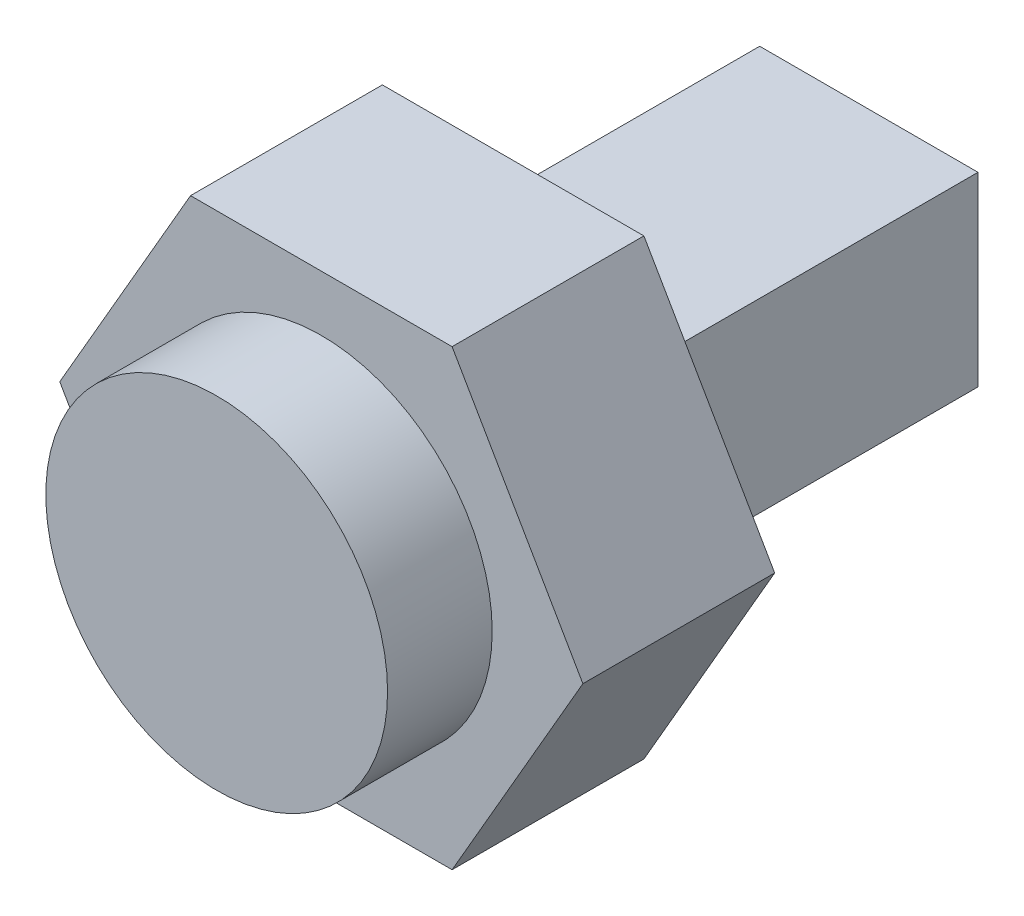
ISO-10303-21;
HEADER;
FILE_DESCRIPTION(('STEP AP214'),'2;1');
FILE_NAME('part.step','',(''),(''),'','','');
FILE_SCHEMA(('AUTOMOTIVE_DESIGN { 1 0 10303 214 1 1 1 1 }'));
ENDSEC;
DATA;
#1=APPLICATION_CONTEXT('core data for automotive mechanical design processes');
#2=APPLICATION_PROTOCOL_DEFINITION('international standard','automotive_design',2000,#1);
#3=PRODUCT_CONTEXT('',#1,'mechanical');
#4=PRODUCT('Part','Part','',(#3));
#5=PRODUCT_RELATED_PRODUCT_CATEGORY('part','',(#4));
#6=PRODUCT_DEFINITION_FORMATION('','',#4);
#7=PRODUCT_DEFINITION_CONTEXT('part definition',#1,'design');
#8=PRODUCT_DEFINITION('design','',#6,#7);
#9=PRODUCT_DEFINITION_SHAPE('','',#8);
#10=(LENGTH_UNIT() NAMED_UNIT(*) SI_UNIT(.MILLI.,.METRE.));
#11=(NAMED_UNIT(*) PLANE_ANGLE_UNIT() SI_UNIT($,.RADIAN.));
#12=(NAMED_UNIT(*) SI_UNIT($,.STERADIAN.) SOLID_ANGLE_UNIT());
#13=UNCERTAINTY_MEASURE_WITH_UNIT(LENGTH_MEASURE(1.E-05),#10,'distance_accuracy_value','');
#14=(GEOMETRIC_REPRESENTATION_CONTEXT(3) GLOBAL_UNCERTAINTY_ASSIGNED_CONTEXT((#13)) GLOBAL_UNIT_ASSIGNED_CONTEXT((#10,
#11,#12)) REPRESENTATION_CONTEXT('',''));
#15=CARTESIAN_POINT('',(0.,0.,0.));
#16=DIRECTION('',(0.,0.,1.));
#17=DIRECTION('',(1.,0.,0.));
#18=AXIS2_PLACEMENT_3D('',#15,#16,#17);
#19=CARTESIAN_POINT('',(0.,0.,21.59));
#20=DIRECTION('',(0.,0.,1.));
#21=DIRECTION('',(1.,0.,0.));
#22=AXIS2_PLACEMENT_3D('',#19,#20,#21);
#23=PLANE('',#22);
#24=CARTESIAN_POINT('',(0.,0.,21.59));
#25=DIRECTION('',(0.,0.,1.));
#26=DIRECTION('',(1.,0.,0.));
#27=AXIS2_PLACEMENT_3D('',#24,#25,#26);
#28=CIRCLE('',#27,12.446);
#29=CARTESIAN_POINT('',(12.446,0.,21.59));
#30=VERTEX_POINT('',#29);
#31=EDGE_CURVE('E20',#30,#30,#28,.F.);
#32=ORIENTED_EDGE('',*,*,#31,.F.);
#33=EDGE_LOOP('',(#32));
#34=FACE_BOUND('',#33,.T.);
#35=ADVANCED_FACE('F17',(#34),#23,.T.);
#36=CARTESIAN_POINT('',(0.,0.,13.97));
#37=DIRECTION('',(0.,0.,1.));
#38=DIRECTION('',(1.,0.,0.));
#39=AXIS2_PLACEMENT_3D('',#36,#37,#38);
#40=CYLINDRICAL_SURFACE('',#39,12.446);
#41=ORIENTED_EDGE('',*,*,#31,.T.);
#42=EDGE_LOOP('',(#41));
#43=FACE_BOUND('',#42,.T.);
#44=CARTESIAN_POINT('',(0.,0.,13.97));
#45=DIRECTION('',(0.,0.,1.));
#46=DIRECTION('',(1.,0.,0.));
#47=AXIS2_PLACEMENT_3D('',#44,#45,#46);
#48=CIRCLE('',#47,12.446);
#49=CARTESIAN_POINT('',(12.446,0.,13.97));
#50=VERTEX_POINT('',#49);
#51=EDGE_CURVE('E113',#50,#50,#48,.F.);
#52=ORIENTED_EDGE('',*,*,#51,.F.);
#53=EDGE_LOOP('',(#52));
#54=FACE_BOUND('',#53,.T.);
#55=ADVANCED_FACE('F127',(#43,#54),#40,.T.);
#56=CARTESIAN_POINT('',(0.,0.,13.97));
#57=DIRECTION('',(0.,0.,1.));
#58=DIRECTION('',(1.,0.,0.));
#59=AXIS2_PLACEMENT_3D('',#56,#57,#58);
#60=PLANE('',#59);
#61=ORIENTED_EDGE('',*,*,#51,.T.);
#62=EDGE_LOOP('',(#61));
#63=FACE_BOUND('',#62,.T.);
#64=DIRECTION('',(1.,0.,0.));
#65=VECTOR('',#64,1.);
#66=CARTESIAN_POINT('',(9.525,16.4977839420936,13.97));
#67=LINE('',#66,#65);
#68=CARTESIAN_POINT('',(-9.525,16.4977839420936,13.97));
#69=VERTEX_POINT('',#68);
#70=CARTESIAN_POINT('',(9.525,16.4977839420936,13.97));
#71=VERTEX_POINT('',#70);
#72=EDGE_CURVE('E109',#69,#71,#67,.T.);
#73=ORIENTED_EDGE('',*,*,#72,.F.);
#74=DIRECTION('',(-0.5,-0.866025403784439,0.));
#75=VECTOR('',#74,1.);
#76=CARTESIAN_POINT('',(-9.525,16.4977839420936,13.97));
#77=LINE('',#76,#75);
#78=CARTESIAN_POINT('',(-19.05,0.,13.97));
#79=VERTEX_POINT('',#78);
#80=EDGE_CURVE('E104',#79,#69,#77,.F.);
#81=ORIENTED_EDGE('',*,*,#80,.F.);
#82=DIRECTION('',(0.5,-0.866025403784439,0.));
#83=VECTOR('',#82,1.);
#84=CARTESIAN_POINT('',(-19.05,0.,13.97));
#85=LINE('',#84,#83);
#86=CARTESIAN_POINT('',(-9.525,-16.4977839420936,13.97));
#87=VERTEX_POINT('',#86);
#88=EDGE_CURVE('E95',#87,#79,#85,.F.);
#89=ORIENTED_EDGE('',*,*,#88,.F.);
#90=DIRECTION('',(1.,0.,0.));
#91=VECTOR('',#90,1.);
#92=CARTESIAN_POINT('',(-9.525,-16.4977839420936,13.97));
#93=LINE('',#92,#91);
#94=CARTESIAN_POINT('',(9.525,-16.4977839420936,13.97));
#95=VERTEX_POINT('',#94);
#96=EDGE_CURVE('E90',#95,#87,#93,.F.);
#97=ORIENTED_EDGE('',*,*,#96,.F.);
#98=DIRECTION('',(0.5,0.866025403784439,0.));
#99=VECTOR('',#98,1.);
#100=CARTESIAN_POINT('',(9.525,-16.4977839420936,13.97));
#101=LINE('',#100,#99);
#102=CARTESIAN_POINT('',(19.05,0.,13.97));
#103=VERTEX_POINT('',#102);
#104=EDGE_CURVE('E329',#103,#95,#101,.F.);
#105=ORIENTED_EDGE('',*,*,#104,.F.);
#106=DIRECTION('',(-0.5,0.866025403784439,0.));
#107=VECTOR('',#106,1.);
#108=CARTESIAN_POINT('',(19.05,0.,13.97));
#109=LINE('',#108,#107);
#110=EDGE_CURVE('E325',#71,#103,#109,.F.);
#111=ORIENTED_EDGE('',*,*,#110,.F.);
#112=EDGE_LOOP('',(#73,#81,#89,#97,#105,#111));
#113=FACE_BOUND('',#112,.T.);
#114=ADVANCED_FACE('F107',(#63,#113),#60,.T.);
#115=CARTESIAN_POINT('',(0.,0.,-25.908));
#116=DIRECTION('',(0.,0.,-1.));
#117=DIRECTION('',(-1.,0.,0.));
#118=AXIS2_PLACEMENT_3D('',#115,#116,#117);
#119=PLANE('',#118);
#120=DIRECTION('',(1.,0.,0.));
#121=VECTOR('',#120,1.);
#122=CARTESIAN_POINT('',(-7.9502,6.7691,-25.908));
#123=LINE('',#122,#121);
#124=CARTESIAN_POINT('',(7.9502,6.7691,-25.908));
#125=VERTEX_POINT('',#124);
#126=CARTESIAN_POINT('',(-7.9502,6.7691,-25.908));
#127=VERTEX_POINT('',#126);
#128=EDGE_CURVE('E298',#125,#127,#123,.F.);
#129=ORIENTED_EDGE('',*,*,#128,.F.);
#130=DIRECTION('',(0.,1.,0.));
#131=VECTOR('',#130,1.);
#132=CARTESIAN_POINT('',(7.9502,6.7691,-25.908));
#133=LINE('',#132,#131);
#134=CARTESIAN_POINT('',(7.9502,-6.7691,-25.908));
#135=VERTEX_POINT('',#134);
#136=EDGE_CURVE('E300',#135,#125,#133,.T.);
#137=ORIENTED_EDGE('',*,*,#136,.F.);
#138=DIRECTION('',(1.,0.,0.));
#139=VECTOR('',#138,1.);
#140=CARTESIAN_POINT('',(7.9502,-6.7691,-25.908));
#141=LINE('',#140,#139);
#142=CARTESIAN_POINT('',(-7.9502,-6.7691,-25.908));
#143=VERTEX_POINT('',#142);
#144=EDGE_CURVE('E315',#143,#135,#141,.T.);
#145=ORIENTED_EDGE('',*,*,#144,.F.);
#146=DIRECTION('',(0.,1.,0.));
#147=VECTOR('',#146,1.);
#148=CARTESIAN_POINT('',(-7.9502,-6.7691,-25.908));
#149=LINE('',#148,#147);
#150=EDGE_CURVE('E302',#127,#143,#149,.F.);
#151=ORIENTED_EDGE('',*,*,#150,.F.);
#152=EDGE_LOOP('',(#129,#137,#145,#151));
#153=FACE_BOUND('',#152,.T.);
#154=ADVANCED_FACE('F178',(#153),#119,.T.);
#155=CARTESIAN_POINT('',(-9.525,16.4977839420936,0.));
#156=DIRECTION('',(-0.866025403784439,0.5,0.));
#157=DIRECTION('',(-0.5,-0.866025403784439,0.));
#158=AXIS2_PLACEMENT_3D('',#155,#156,#157);
#159=PLANE('',#158);
#160=DIRECTION('',(0.,0.,1.));
#161=VECTOR('',#160,1.);
#162=CARTESIAN_POINT('',(-9.525,16.4977839420936,0.));
#163=LINE('',#162,#161);
#164=CARTESIAN_POINT('',(-9.525,16.4977839420936,0.));
#165=VERTEX_POINT('',#164);
#166=EDGE_CURVE('E321',#165,#69,#163,.T.);
#167=ORIENTED_EDGE('',*,*,#166,.F.);
#168=DIRECTION('',(-0.5,-0.866025403784439,0.));
#169=VECTOR('',#168,1.);
#170=CARTESIAN_POINT('',(-9.525,16.4977839420936,0.));
#171=LINE('',#170,#169);
#172=CARTESIAN_POINT('',(-19.05,0.,0.));
#173=VERTEX_POINT('',#172);
#174=EDGE_CURVE('E117',#165,#173,#171,.T.);
#175=ORIENTED_EDGE('',*,*,#174,.T.);
#176=DIRECTION('',(0.,0.,1.));
#177=VECTOR('',#176,1.);
#178=CARTESIAN_POINT('',(-19.05,0.,0.));
#179=LINE('',#178,#177);
#180=EDGE_CURVE('E100',#79,#173,#179,.F.);
#181=ORIENTED_EDGE('',*,*,#180,.F.);
#182=ORIENTED_EDGE('',*,*,#80,.T.);
#183=EDGE_LOOP('',(#167,#175,#181,#182));
#184=FACE_BOUND('',#183,.T.);
#185=ADVANCED_FACE('F116',(#184),#159,.T.);
#186=CARTESIAN_POINT('',(-19.05,0.,0.));
#187=DIRECTION('',(-0.866025403784439,-0.5,0.));
#188=DIRECTION('',(0.5,-0.866025403784439,0.));
#189=AXIS2_PLACEMENT_3D('',#186,#187,#188);
#190=PLANE('',#189);
#191=ORIENTED_EDGE('',*,*,#180,.T.);
#192=DIRECTION('',(0.5,-0.866025403784439,0.));
#193=VECTOR('',#192,1.);
#194=CARTESIAN_POINT('',(-19.05,0.,0.));
#195=LINE('',#194,#193);
#196=CARTESIAN_POINT('',(-9.525,-16.4977839420936,0.));
#197=VERTEX_POINT('',#196);
#198=EDGE_CURVE('E335',#173,#197,#195,.T.);
#199=ORIENTED_EDGE('',*,*,#198,.T.);
#200=DIRECTION('',(0.,0.,-1.));
#201=VECTOR('',#200,1.);
#202=CARTESIAN_POINT('',(-9.525,-16.4977839420936,0.));
#203=LINE('',#202,#201);
#204=EDGE_CURVE('E102',#87,#197,#203,.T.);
#205=ORIENTED_EDGE('',*,*,#204,.F.);
#206=ORIENTED_EDGE('',*,*,#88,.T.);
#207=EDGE_LOOP('',(#191,#199,#205,#206));
#208=FACE_BOUND('',#207,.T.);
#209=ADVANCED_FACE('F97',(#208),#190,.T.);
#210=CARTESIAN_POINT('',(-9.525,-16.4977839420936,0.));
#211=DIRECTION('',(0.,-1.,0.));
#212=DIRECTION('',(0.,0.,-1.));
#213=AXIS2_PLACEMENT_3D('',#210,#211,#212);
#214=PLANE('',#213);
#215=ORIENTED_EDGE('',*,*,#204,.T.);
#216=DIRECTION('',(1.,0.,0.));
#217=VECTOR('',#216,1.);
#218=CARTESIAN_POINT('',(0.,-16.4977839420936,0.));
#219=LINE('',#218,#217);
#220=CARTESIAN_POINT('',(9.525,-16.4977839420936,0.));
#221=VERTEX_POINT('',#220);
#222=EDGE_CURVE('E332',#197,#221,#219,.T.);
#223=ORIENTED_EDGE('',*,*,#222,.T.);
#224=DIRECTION('',(0.,0.,1.));
#225=VECTOR('',#224,1.);
#226=CARTESIAN_POINT('',(9.525,-16.4977839420936,0.));
#227=LINE('',#226,#225);
#228=EDGE_CURVE('E327',#95,#221,#227,.F.);
#229=ORIENTED_EDGE('',*,*,#228,.F.);
#230=ORIENTED_EDGE('',*,*,#96,.T.);
#231=EDGE_LOOP('',(#215,#223,#229,#230));
#232=FACE_BOUND('',#231,.T.);
#233=ADVANCED_FACE('F170',(#232),#214,.T.);
#234=CARTESIAN_POINT('',(9.525,-16.4977839420936,0.));
#235=DIRECTION('',(0.866025403784439,-0.5,0.));
#236=DIRECTION('',(0.5,0.866025403784439,0.));
#237=AXIS2_PLACEMENT_3D('',#234,#235,#236);
#238=PLANE('',#237);
#239=ORIENTED_EDGE('',*,*,#228,.T.);
#240=DIRECTION('',(0.5,0.866025403784439,0.));
#241=VECTOR('',#240,1.);
#242=CARTESIAN_POINT('',(9.525,-16.4977839420936,0.));
#243=LINE('',#242,#241);
#244=CARTESIAN_POINT('',(19.05,0.,0.));
#245=VERTEX_POINT('',#244);
#246=EDGE_CURVE('E337',#221,#245,#243,.T.);
#247=ORIENTED_EDGE('',*,*,#246,.T.);
#248=DIRECTION('',(0.,0.,1.));
#249=VECTOR('',#248,1.);
#250=CARTESIAN_POINT('',(19.05,0.,0.));
#251=LINE('',#250,#249);
#252=EDGE_CURVE('E323',#103,#245,#251,.F.);
#253=ORIENTED_EDGE('',*,*,#252,.F.);
#254=ORIENTED_EDGE('',*,*,#104,.T.);
#255=EDGE_LOOP('',(#239,#247,#253,#254));
#256=FACE_BOUND('',#255,.T.);
#257=ADVANCED_FACE('F166',(#256),#238,.T.);
#258=CARTESIAN_POINT('',(19.05,0.,0.));
#259=DIRECTION('',(0.866025403784439,0.5,0.));
#260=DIRECTION('',(-0.5,0.866025403784439,0.));
#261=AXIS2_PLACEMENT_3D('',#258,#259,#260);
#262=PLANE('',#261);
#263=ORIENTED_EDGE('',*,*,#252,.T.);
#264=DIRECTION('',(-0.5,0.866025403784439,0.));
#265=VECTOR('',#264,1.);
#266=CARTESIAN_POINT('',(19.05,0.,0.));
#267=LINE('',#266,#265);
#268=CARTESIAN_POINT('',(9.525,16.4977839420936,0.));
#269=VERTEX_POINT('',#268);
#270=EDGE_CURVE('E342',#245,#269,#267,.T.);
#271=ORIENTED_EDGE('',*,*,#270,.T.);
#272=DIRECTION('',(0.,0.,1.));
#273=VECTOR('',#272,1.);
#274=CARTESIAN_POINT('',(9.525,16.4977839420936,0.));
#275=LINE('',#274,#273);
#276=EDGE_CURVE('E318',#71,#269,#275,.F.);
#277=ORIENTED_EDGE('',*,*,#276,.F.);
#278=ORIENTED_EDGE('',*,*,#110,.T.);
#279=EDGE_LOOP('',(#263,#271,#277,#278));
#280=FACE_BOUND('',#279,.T.);
#281=ADVANCED_FACE('F162',(#280),#262,.T.);
#282=CARTESIAN_POINT('',(9.525,16.4977839420936,0.));
#283=DIRECTION('',(0.,1.,0.));
#284=DIRECTION('',(0.,0.,1.));
#285=AXIS2_PLACEMENT_3D('',#282,#283,#284);
#286=PLANE('',#285);
#287=ORIENTED_EDGE('',*,*,#276,.T.);
#288=DIRECTION('',(1.,0.,0.));
#289=VECTOR('',#288,1.);
#290=CARTESIAN_POINT('',(0.,16.4977839420936,0.));
#291=LINE('',#290,#289);
#292=EDGE_CURVE('E345',#269,#165,#291,.F.);
#293=ORIENTED_EDGE('',*,*,#292,.T.);
#294=ORIENTED_EDGE('',*,*,#166,.T.);
#295=ORIENTED_EDGE('',*,*,#72,.T.);
#296=EDGE_LOOP('',(#287,#293,#294,#295));
#297=FACE_BOUND('',#296,.T.);
#298=ADVANCED_FACE('F158',(#297),#286,.T.);
#299=CARTESIAN_POINT('',(7.9502,6.7691,0.));
#300=DIRECTION('',(1.,0.,0.));
#301=DIRECTION('',(0.,0.,-1.));
#302=AXIS2_PLACEMENT_3D('',#299,#300,#301);
#303=PLANE('',#302);
#304=DIRECTION('',(0.,0.,1.));
#305=VECTOR('',#304,1.);
#306=CARTESIAN_POINT('',(7.9502,6.7691,0.));
#307=LINE('',#306,#305);
#308=CARTESIAN_POINT('',(7.9502,6.7691,0.));
#309=VERTEX_POINT('',#308);
#310=EDGE_CURVE('E304',#309,#125,#307,.F.);
#311=ORIENTED_EDGE('',*,*,#310,.F.);
#312=DIRECTION('',(0.,1.,0.));
#313=VECTOR('',#312,1.);
#314=CARTESIAN_POINT('',(7.9502,0.,0.));
#315=LINE('',#314,#313);
#316=CARTESIAN_POINT('',(7.9502,-6.7691,0.));
#317=VERTEX_POINT('',#316);
#318=EDGE_CURVE('E348',#309,#317,#315,.F.);
#319=ORIENTED_EDGE('',*,*,#318,.T.);
#320=DIRECTION('',(0.,0.,-1.));
#321=VECTOR('',#320,1.);
#322=CARTESIAN_POINT('',(7.9502,-6.7691,0.));
#323=LINE('',#322,#321);
#324=EDGE_CURVE('E313',#135,#317,#323,.F.);
#325=ORIENTED_EDGE('',*,*,#324,.F.);
#326=ORIENTED_EDGE('',*,*,#136,.T.);
#327=EDGE_LOOP('',(#311,#319,#325,#326));
#328=FACE_BOUND('',#327,.T.);
#329=ADVANCED_FACE('F154',(#328),#303,.T.);
#330=CARTESIAN_POINT('',(7.9502,-6.7691,0.));
#331=DIRECTION('',(0.,-1.,0.));
#332=DIRECTION('',(0.,0.,-1.));
#333=AXIS2_PLACEMENT_3D('',#330,#331,#332);
#334=PLANE('',#333);
#335=ORIENTED_EDGE('',*,*,#324,.T.);
#336=DIRECTION('',(1.,0.,0.));
#337=VECTOR('',#336,1.);
#338=CARTESIAN_POINT('',(0.,-6.7691,0.));
#339=LINE('',#338,#337);
#340=CARTESIAN_POINT('',(-7.9502,-6.7691,0.));
#341=VERTEX_POINT('',#340);
#342=EDGE_CURVE('E351',#317,#341,#339,.F.);
#343=ORIENTED_EDGE('',*,*,#342,.T.);
#344=DIRECTION('',(0.,0.,1.));
#345=VECTOR('',#344,1.);
#346=CARTESIAN_POINT('',(-7.9502,-6.7691,0.));
#347=LINE('',#346,#345);
#348=EDGE_CURVE('E307',#143,#341,#347,.T.);
#349=ORIENTED_EDGE('',*,*,#348,.F.);
#350=ORIENTED_EDGE('',*,*,#144,.T.);
#351=EDGE_LOOP('',(#335,#343,#349,#350));
#352=FACE_BOUND('',#351,.T.);
#353=ADVANCED_FACE('F150',(#352),#334,.T.);
#354=CARTESIAN_POINT('',(-7.9502,-6.7691,0.));
#355=DIRECTION('',(-1.,0.,0.));
#356=DIRECTION('',(0.,0.,1.));
#357=AXIS2_PLACEMENT_3D('',#354,#355,#356);
#358=PLANE('',#357);
#359=ORIENTED_EDGE('',*,*,#348,.T.);
#360=DIRECTION('',(0.,1.,0.));
#361=VECTOR('',#360,1.);
#362=CARTESIAN_POINT('',(-7.9502,0.,0.));
#363=LINE('',#362,#361);
#364=CARTESIAN_POINT('',(-7.9502,6.7691,0.));
#365=VERTEX_POINT('',#364);
#366=EDGE_CURVE('E26',#341,#365,#363,.T.);
#367=ORIENTED_EDGE('',*,*,#366,.T.);
#368=DIRECTION('',(0.,0.,1.));
#369=VECTOR('',#368,1.);
#370=CARTESIAN_POINT('',(-7.9502,6.7691,0.));
#371=LINE('',#370,#369);
#372=EDGE_CURVE('E34',#127,#365,#371,.T.);
#373=ORIENTED_EDGE('',*,*,#372,.F.);
#374=ORIENTED_EDGE('',*,*,#150,.T.);
#375=EDGE_LOOP('',(#359,#367,#373,#374));
#376=FACE_BOUND('',#375,.T.);
#377=ADVANCED_FACE('F143',(#376),#358,.T.);
#378=CARTESIAN_POINT('',(-7.9502,6.7691,0.));
#379=DIRECTION('',(0.,1.,0.));
#380=DIRECTION('',(0.,0.,1.));
#381=AXIS2_PLACEMENT_3D('',#378,#379,#380);
#382=PLANE('',#381);
#383=ORIENTED_EDGE('',*,*,#372,.T.);
#384=DIRECTION('',(1.,0.,0.));
#385=VECTOR('',#384,1.);
#386=CARTESIAN_POINT('',(0.,6.7691,0.));
#387=LINE('',#386,#385);
#388=EDGE_CURVE('E11',#365,#309,#387,.T.);
#389=ORIENTED_EDGE('',*,*,#388,.T.);
#390=ORIENTED_EDGE('',*,*,#310,.T.);
#391=ORIENTED_EDGE('',*,*,#128,.T.);
#392=EDGE_LOOP('',(#383,#389,#390,#391));
#393=FACE_BOUND('',#392,.T.);
#394=ADVANCED_FACE('F137',(#393),#382,.T.);
#395=CARTESIAN_POINT('',(0.,0.,0.));
#396=DIRECTION('',(0.,0.,1.));
#397=DIRECTION('',(1.,0.,0.));
#398=AXIS2_PLACEMENT_3D('',#395,#396,#397);
#399=PLANE('',#398);
#400=ORIENTED_EDGE('',*,*,#366,.F.);
#401=ORIENTED_EDGE('',*,*,#342,.F.);
#402=ORIENTED_EDGE('',*,*,#318,.F.);
#403=ORIENTED_EDGE('',*,*,#388,.F.);
#404=EDGE_LOOP('',(#400,#401,#402,#403));
#405=FACE_BOUND('',#404,.T.);
#406=ORIENTED_EDGE('',*,*,#270,.F.);
#407=ORIENTED_EDGE('',*,*,#246,.F.);
#408=ORIENTED_EDGE('',*,*,#222,.F.);
#409=ORIENTED_EDGE('',*,*,#198,.F.);
#410=ORIENTED_EDGE('',*,*,#174,.F.);
#411=ORIENTED_EDGE('',*,*,#292,.F.);
#412=EDGE_LOOP('',(#406,#407,#408,#409,#410,#411));
#413=FACE_BOUND('',#412,.T.);
#414=ADVANCED_FACE('F135',(#405,#413),#399,.F.);
#415=CLOSED_SHELL('',(#35,#55,#114,#154,#185,#209,#233,#257,#281,#298,#329,#353,#377,#394,#414));
#416=MANIFOLD_SOLID_BREP('B1',#415);
#417=ADVANCED_BREP_SHAPE_REPRESENTATION('',(#18,#416),#14);
#418=SHAPE_DEFINITION_REPRESENTATION(#9,#417);
ENDSEC;
END-ISO-10303-21;
